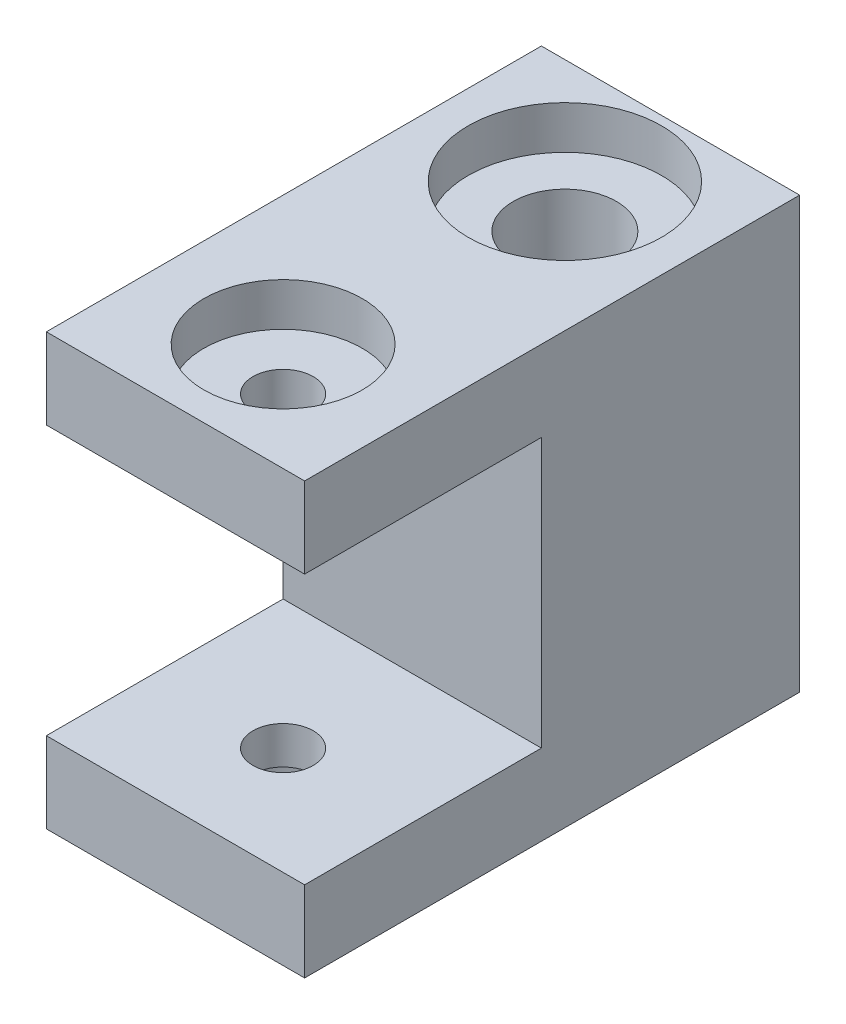
ISO-10303-21;
HEADER;
FILE_DESCRIPTION(('STEP AP214'),'2;1');
FILE_NAME('part.step','',(''),(''),'','','');
FILE_SCHEMA(('AUTOMOTIVE_DESIGN { 1 0 10303 214 1 1 1 1 }'));
ENDSEC;
DATA;
#1=APPLICATION_CONTEXT('core data for automotive mechanical design processes');
#2=APPLICATION_PROTOCOL_DEFINITION('international standard','automotive_design',2000,#1);
#3=PRODUCT_CONTEXT('',#1,'mechanical');
#4=PRODUCT('Part','Part','',(#3));
#5=PRODUCT_RELATED_PRODUCT_CATEGORY('part','',(#4));
#6=PRODUCT_DEFINITION_FORMATION('','',#4);
#7=PRODUCT_DEFINITION_CONTEXT('part definition',#1,'design');
#8=PRODUCT_DEFINITION('design','',#6,#7);
#9=PRODUCT_DEFINITION_SHAPE('','',#8);
#10=(LENGTH_UNIT() NAMED_UNIT(*) SI_UNIT(.MILLI.,.METRE.));
#11=(NAMED_UNIT(*) PLANE_ANGLE_UNIT() SI_UNIT($,.RADIAN.));
#12=(NAMED_UNIT(*) SI_UNIT($,.STERADIAN.) SOLID_ANGLE_UNIT());
#13=UNCERTAINTY_MEASURE_WITH_UNIT(LENGTH_MEASURE(1.E-05),#10,'distance_accuracy_value','');
#14=(GEOMETRIC_REPRESENTATION_CONTEXT(3) GLOBAL_UNCERTAINTY_ASSIGNED_CONTEXT((#13)) GLOBAL_UNIT_ASSIGNED_CONTEXT((#10,
#11,#12)) REPRESENTATION_CONTEXT('',''));
#15=CARTESIAN_POINT('',(0.,0.,0.));
#16=DIRECTION('',(0.,0.,1.));
#17=DIRECTION('',(1.,0.,0.));
#18=AXIS2_PLACEMENT_3D('',#15,#16,#17);
#19=CARTESIAN_POINT('',(0.,-31.75,20.6375));
#20=DIRECTION('',(0.,1.,0.));
#21=DIRECTION('',(0.,0.,1.));
#22=AXIS2_PLACEMENT_3D('',#19,#20,#21);
#23=CYLINDRICAL_SURFACE('',#22,4.445);
#24=CARTESIAN_POINT('',(0.,-19.84375,20.6375));
#25=DIRECTION('',(0.,-1.,0.));
#26=DIRECTION('',(0.,0.,-1.));
#27=AXIS2_PLACEMENT_3D('',#24,#25,#26);
#28=CIRCLE('',#27,4.445);
#29=CARTESIAN_POINT('',(0.,-19.84375,16.1925));
#30=VERTEX_POINT('',#29);
#31=EDGE_CURVE('E170',#30,#30,#28,.T.);
#32=ORIENTED_EDGE('',*,*,#31,.F.);
#33=EDGE_LOOP('',(#32));
#34=FACE_BOUND('',#33,.T.);
#35=CARTESIAN_POINT('',(0.,-25.4,20.6375));
#36=DIRECTION('',(0.,-1.,0.));
#37=DIRECTION('',(0.,0.,-1.));
#38=AXIS2_PLACEMENT_3D('',#35,#36,#37);
#39=CIRCLE('',#38,4.445);
#40=CARTESIAN_POINT('',(0.,-25.4,16.1925));
#41=VERTEX_POINT('',#40);
#42=EDGE_CURVE('E176',#41,#41,#39,.F.);
#43=ORIENTED_EDGE('',*,*,#42,.F.);
#44=EDGE_LOOP('',(#43));
#45=FACE_BOUND('',#44,.T.);
#46=ADVANCED_FACE('F34',(#34,#45),#23,.F.);
#47=CARTESIAN_POINT('',(0.,19.84375,20.6375));
#48=DIRECTION('',(0.,1.,0.));
#49=DIRECTION('',(0.,0.,1.));
#50=AXIS2_PLACEMENT_3D('',#47,#48,#49);
#51=CIRCLE('',#50,4.445);
#52=CARTESIAN_POINT('',(0.,19.84375,25.0825));
#53=VERTEX_POINT('',#52);
#54=EDGE_CURVE('E138',#53,#53,#51,.T.);
#55=ORIENTED_EDGE('',*,*,#54,.F.);
#56=EDGE_LOOP('',(#55));
#57=FACE_BOUND('',#56,.T.);
#58=CARTESIAN_POINT('',(0.,25.4,20.6375));
#59=DIRECTION('',(0.,1.,0.));
#60=DIRECTION('',(0.,0.,1.));
#61=AXIS2_PLACEMENT_3D('',#58,#59,#60);
#62=CIRCLE('',#61,4.445);
#63=CARTESIAN_POINT('',(0.,25.4,25.0825));
#64=VERTEX_POINT('',#63);
#65=EDGE_CURVE('E173',#64,#64,#62,.F.);
#66=ORIENTED_EDGE('',*,*,#65,.F.);
#67=EDGE_LOOP('',(#66));
#68=FACE_BOUND('',#67,.T.);
#69=ADVANCED_FACE('F237',(#57,#68),#23,.F.);
#70=CARTESIAN_POINT('',(0.,0.,36.5125));
#71=DIRECTION('',(0.,0.,-1.));
#72=DIRECTION('',(-1.,0.,0.));
#73=AXIS2_PLACEMENT_3D('',#70,#71,#72);
#74=PLANE('',#73);
#75=DIRECTION('',(0.,-1.,0.));
#76=VECTOR('',#75,1.);
#77=CARTESIAN_POINT('',(-19.05,-31.75,36.5125));
#78=LINE('',#77,#76);
#79=CARTESIAN_POINT('',(-19.05,31.75,36.5125));
#80=VERTEX_POINT('',#79);
#81=CARTESIAN_POINT('',(-19.05,19.84375,36.5125));
#82=VERTEX_POINT('',#81);
#83=EDGE_CURVE('E153',#80,#82,#78,.T.);
#84=ORIENTED_EDGE('',*,*,#83,.T.);
#85=DIRECTION('',(1.,0.,0.));
#86=VECTOR('',#85,1.);
#87=CARTESIAN_POINT('',(-19.05,19.84375,36.5125));
#88=LINE('',#87,#86);
#89=CARTESIAN_POINT('',(19.05,19.84375,36.5125));
#90=VERTEX_POINT('',#89);
#91=EDGE_CURVE('E144',#82,#90,#88,.T.);
#92=ORIENTED_EDGE('',*,*,#91,.T.);
#93=DIRECTION('',(0.,1.,0.));
#94=VECTOR('',#93,1.);
#95=CARTESIAN_POINT('',(19.05,-31.75,36.5125));
#96=LINE('',#95,#94);
#97=CARTESIAN_POINT('',(19.05,31.75,36.5125));
#98=VERTEX_POINT('',#97);
#99=EDGE_CURVE('E89',#90,#98,#96,.T.);
#100=ORIENTED_EDGE('',*,*,#99,.T.);
#101=DIRECTION('',(-1.,0.,0.));
#102=VECTOR('',#101,1.);
#103=CARTESIAN_POINT('',(-19.05,31.75,36.5125));
#104=LINE('',#103,#102);
#105=EDGE_CURVE('E151',#98,#80,#104,.T.);
#106=ORIENTED_EDGE('',*,*,#105,.T.);
#107=EDGE_LOOP('',(#84,#92,#100,#106));
#108=FACE_BOUND('',#107,.T.);
#109=ADVANCED_FACE('F230',(#108),#74,.F.);
#110=CARTESIAN_POINT('',(19.05,-31.75,36.5125));
#111=DIRECTION('',(-1.,0.,0.));
#112=DIRECTION('',(0.,0.,1.));
#113=AXIS2_PLACEMENT_3D('',#110,#111,#112);
#114=PLANE('',#113);
#115=ORIENTED_EDGE('',*,*,#99,.F.);
#116=DIRECTION('',(0.,0.,1.));
#117=VECTOR('',#116,1.);
#118=CARTESIAN_POINT('',(19.05,19.84375,1.5875));
#119=LINE('',#118,#117);
#120=CARTESIAN_POINT('',(19.05,19.84375,1.5875));
#121=VERTEX_POINT('',#120);
#122=EDGE_CURVE('E133',#121,#90,#119,.T.);
#123=ORIENTED_EDGE('',*,*,#122,.F.);
#124=DIRECTION('',(0.,1.,0.));
#125=VECTOR('',#124,1.);
#126=CARTESIAN_POINT('',(19.05,-19.84375,1.5875));
#127=LINE('',#126,#125);
#128=CARTESIAN_POINT('',(19.05,-19.84375,1.5875));
#129=VERTEX_POINT('',#128);
#130=EDGE_CURVE('E135',#129,#121,#127,.T.);
#131=ORIENTED_EDGE('',*,*,#130,.F.);
#132=DIRECTION('',(0.,0.,-1.));
#133=VECTOR('',#132,1.);
#134=CARTESIAN_POINT('',(19.05,-19.84375,1.5875));
#135=LINE('',#134,#133);
#136=CARTESIAN_POINT('',(19.05,-19.84375,36.5125));
#137=VERTEX_POINT('',#136);
#138=EDGE_CURVE('E114',#137,#129,#135,.T.);
#139=ORIENTED_EDGE('',*,*,#138,.F.);
#140=CARTESIAN_POINT('',(19.05,-31.75,36.5125));
#141=VERTEX_POINT('',#140);
#142=EDGE_CURVE('E149',#141,#137,#96,.T.);
#143=ORIENTED_EDGE('',*,*,#142,.F.);
#144=DIRECTION('',(0.,0.,-1.));
#145=VECTOR('',#144,1.);
#146=CARTESIAN_POINT('',(19.05,-31.75,36.5125));
#147=LINE('',#146,#145);
#148=CARTESIAN_POINT('',(19.05,-31.75,-36.5125));
#149=VERTEX_POINT('',#148);
#150=EDGE_CURVE('E157',#141,#149,#147,.T.);
#151=ORIENTED_EDGE('',*,*,#150,.T.);
#152=DIRECTION('',(0.,1.,0.));
#153=VECTOR('',#152,1.);
#154=CARTESIAN_POINT('',(19.05,-31.75,-36.5125));
#155=LINE('',#154,#153);
#156=CARTESIAN_POINT('',(19.05,31.75,-36.5125));
#157=VERTEX_POINT('',#156);
#158=EDGE_CURVE('E146',#149,#157,#155,.T.);
#159=ORIENTED_EDGE('',*,*,#158,.T.);
#160=DIRECTION('',(0.,0.,-1.));
#161=VECTOR('',#160,1.);
#162=CARTESIAN_POINT('',(19.05,31.75,36.5125));
#163=LINE('',#162,#161);
#164=EDGE_CURVE('E11',#98,#157,#163,.T.);
#165=ORIENTED_EDGE('',*,*,#164,.F.);
#166=EDGE_LOOP('',(#115,#123,#131,#139,#143,#151,#159,#165));
#167=FACE_BOUND('',#166,.T.);
#168=ADVANCED_FACE('F36',(#167),#114,.F.);
#169=CARTESIAN_POINT('',(-19.05,31.75,36.5125));
#170=DIRECTION('',(0.,-1.,0.));
#171=DIRECTION('',(0.,0.,-1.));
#172=AXIS2_PLACEMENT_3D('',#169,#170,#171);
#173=PLANE('',#172);
#174=CARTESIAN_POINT('',(0.,31.75,-20.9296));
#175=DIRECTION('',(0.,1.,0.));
#176=DIRECTION('',(0.,0.,1.));
#177=AXIS2_PLACEMENT_3D('',#174,#175,#176);
#178=CIRCLE('',#177,14.2621);
#179=CARTESIAN_POINT('',(0.,31.75,-6.6675));
#180=VERTEX_POINT('',#179);
#181=EDGE_CURVE('E178',#180,#180,#178,.T.);
#182=ORIENTED_EDGE('',*,*,#181,.F.);
#183=EDGE_LOOP('',(#182));
#184=FACE_BOUND('',#183,.T.);
#185=CARTESIAN_POINT('',(0.,31.75,20.6375));
#186=DIRECTION('',(0.,1.,0.));
#187=DIRECTION('',(0.,0.,1.));
#188=AXIS2_PLACEMENT_3D('',#185,#186,#187);
#189=CIRCLE('',#188,11.684);
#190=CARTESIAN_POINT('',(0.,31.75,32.3215));
#191=VERTEX_POINT('',#190);
#192=EDGE_CURVE('E198',#191,#191,#189,.T.);
#193=ORIENTED_EDGE('',*,*,#192,.F.);
#194=EDGE_LOOP('',(#193));
#195=FACE_BOUND('',#194,.T.);
#196=DIRECTION('',(-1.,0.,0.));
#197=VECTOR('',#196,1.);
#198=CARTESIAN_POINT('',(-19.05,31.75,-36.5125));
#199=LINE('',#198,#197);
#200=CARTESIAN_POINT('',(-19.05,31.75,-36.5125));
#201=VERTEX_POINT('',#200);
#202=EDGE_CURVE('E160',#157,#201,#199,.T.);
#203=ORIENTED_EDGE('',*,*,#202,.T.);
#204=DIRECTION('',(0.,0.,-1.));
#205=VECTOR('',#204,1.);
#206=CARTESIAN_POINT('',(-19.05,31.75,36.5125));
#207=LINE('',#206,#205);
#208=EDGE_CURVE('E43',#80,#201,#207,.T.);
#209=ORIENTED_EDGE('',*,*,#208,.F.);
#210=ORIENTED_EDGE('',*,*,#105,.F.);
#211=ORIENTED_EDGE('',*,*,#164,.T.);
#212=EDGE_LOOP('',(#203,#209,#210,#211));
#213=FACE_BOUND('',#212,.T.);
#214=ADVANCED_FACE('F206',(#184,#195,#213),#173,.F.);
#215=CARTESIAN_POINT('',(-19.05,-31.75,36.5125));
#216=DIRECTION('',(1.,0.,0.));
#217=DIRECTION('',(0.,0.,-1.));
#218=AXIS2_PLACEMENT_3D('',#215,#216,#217);
#219=PLANE('',#218);
#220=DIRECTION('',(0.,1.,0.));
#221=VECTOR('',#220,1.);
#222=CARTESIAN_POINT('',(-19.05,-19.84375,1.5875));
#223=LINE('',#222,#221);
#224=CARTESIAN_POINT('',(-19.05,-19.84375,1.5875));
#225=VERTEX_POINT('',#224);
#226=CARTESIAN_POINT('',(-19.05,19.84375,1.5875));
#227=VERTEX_POINT('',#226);
#228=EDGE_CURVE('E122',#225,#227,#223,.T.);
#229=ORIENTED_EDGE('',*,*,#228,.T.);
#230=DIRECTION('',(0.,0.,1.));
#231=VECTOR('',#230,1.);
#232=CARTESIAN_POINT('',(-19.05,19.84375,1.5875));
#233=LINE('',#232,#231);
#234=EDGE_CURVE('E127',#227,#82,#233,.T.);
#235=ORIENTED_EDGE('',*,*,#234,.T.);
#236=ORIENTED_EDGE('',*,*,#83,.F.);
#237=ORIENTED_EDGE('',*,*,#208,.T.);
#238=DIRECTION('',(0.,-1.,0.));
#239=VECTOR('',#238,1.);
#240=CARTESIAN_POINT('',(-19.05,-31.75,-36.5125));
#241=LINE('',#240,#239);
#242=CARTESIAN_POINT('',(-19.05,-31.75,-36.5125));
#243=VERTEX_POINT('',#242);
#244=EDGE_CURVE('E162',#201,#243,#241,.T.);
#245=ORIENTED_EDGE('',*,*,#244,.T.);
#246=DIRECTION('',(0.,0.,-1.));
#247=VECTOR('',#246,1.);
#248=CARTESIAN_POINT('',(-19.05,-31.75,36.5125));
#249=LINE('',#248,#247);
#250=CARTESIAN_POINT('',(-19.05,-31.75,36.5125));
#251=VERTEX_POINT('',#250);
#252=EDGE_CURVE('E166',#251,#243,#249,.T.);
#253=ORIENTED_EDGE('',*,*,#252,.F.);
#254=CARTESIAN_POINT('',(-19.05,-19.84375,36.5125));
#255=VERTEX_POINT('',#254);
#256=EDGE_CURVE('E132',#255,#251,#78,.T.);
#257=ORIENTED_EDGE('',*,*,#256,.F.);
#258=DIRECTION('',(0.,0.,-1.));
#259=VECTOR('',#258,1.);
#260=CARTESIAN_POINT('',(-19.05,-19.84375,1.5875));
#261=LINE('',#260,#259);
#262=EDGE_CURVE('E51',#255,#225,#261,.T.);
#263=ORIENTED_EDGE('',*,*,#262,.T.);
#264=EDGE_LOOP('',(#229,#235,#236,#237,#245,#253,#257,#263));
#265=FACE_BOUND('',#264,.T.);
#266=ADVANCED_FACE('F130',(#265),#219,.F.);
#267=CARTESIAN_POINT('',(-19.05,-31.75,36.5125));
#268=DIRECTION('',(0.,1.,0.));
#269=DIRECTION('',(0.,0.,1.));
#270=AXIS2_PLACEMENT_3D('',#267,#268,#269);
#271=PLANE('',#270);
#272=CARTESIAN_POINT('',(0.,-31.75,-20.9296));
#273=DIRECTION('',(0.,1.,0.));
#274=DIRECTION('',(0.,0.,1.));
#275=AXIS2_PLACEMENT_3D('',#272,#273,#274);
#276=CIRCLE('',#275,14.2621);
#277=CARTESIAN_POINT('',(0.,-31.75,-6.6675));
#278=VERTEX_POINT('',#277);
#279=EDGE_CURVE('E194',#278,#278,#276,.T.);
#280=ORIENTED_EDGE('',*,*,#279,.T.);
#281=EDGE_LOOP('',(#280));
#282=FACE_BOUND('',#281,.T.);
#283=CARTESIAN_POINT('',(0.,-31.75,20.6375));
#284=DIRECTION('',(0.,1.,0.));
#285=DIRECTION('',(0.,0.,1.));
#286=AXIS2_PLACEMENT_3D('',#283,#284,#285);
#287=CIRCLE('',#286,11.684);
#288=CARTESIAN_POINT('',(0.,-31.75,32.3215));
#289=VERTEX_POINT('',#288);
#290=EDGE_CURVE('E186',#289,#289,#287,.T.);
#291=ORIENTED_EDGE('',*,*,#290,.T.);
#292=EDGE_LOOP('',(#291));
#293=FACE_BOUND('',#292,.T.);
#294=DIRECTION('',(1.,0.,0.));
#295=VECTOR('',#294,1.);
#296=CARTESIAN_POINT('',(-19.05,-31.75,-36.5125));
#297=LINE('',#296,#295);
#298=EDGE_CURVE('E81',#243,#149,#297,.T.);
#299=ORIENTED_EDGE('',*,*,#298,.T.);
#300=ORIENTED_EDGE('',*,*,#150,.F.);
#301=DIRECTION('',(1.,0.,0.));
#302=VECTOR('',#301,1.);
#303=CARTESIAN_POINT('',(-19.05,-31.75,36.5125));
#304=LINE('',#303,#302);
#305=EDGE_CURVE('E60',#251,#141,#304,.T.);
#306=ORIENTED_EDGE('',*,*,#305,.F.);
#307=ORIENTED_EDGE('',*,*,#252,.T.);
#308=EDGE_LOOP('',(#299,#300,#306,#307));
#309=FACE_BOUND('',#308,.T.);
#310=ADVANCED_FACE('F219',(#282,#293,#309),#271,.F.);
#311=ORIENTED_EDGE('',*,*,#142,.T.);
#312=DIRECTION('',(1.,0.,0.));
#313=VECTOR('',#312,1.);
#314=CARTESIAN_POINT('',(-19.05,-19.84375,36.5125));
#315=LINE('',#314,#313);
#316=EDGE_CURVE('E119',#255,#137,#315,.T.);
#317=ORIENTED_EDGE('',*,*,#316,.F.);
#318=ORIENTED_EDGE('',*,*,#256,.T.);
#319=ORIENTED_EDGE('',*,*,#305,.T.);
#320=EDGE_LOOP('',(#311,#317,#318,#319));
#321=FACE_BOUND('',#320,.T.);
#322=ADVANCED_FACE('F221',(#321),#74,.F.);
#323=CARTESIAN_POINT('',(0.,0.,-36.5125));
#324=DIRECTION('',(0.,0.,-1.));
#325=DIRECTION('',(-1.,0.,0.));
#326=AXIS2_PLACEMENT_3D('',#323,#324,#325);
#327=PLANE('',#326);
#328=ORIENTED_EDGE('',*,*,#158,.F.);
#329=ORIENTED_EDGE('',*,*,#298,.F.);
#330=ORIENTED_EDGE('',*,*,#244,.F.);
#331=ORIENTED_EDGE('',*,*,#202,.F.);
#332=EDGE_LOOP('',(#328,#329,#330,#331));
#333=FACE_BOUND('',#332,.T.);
#334=ADVANCED_FACE('F216',(#333),#327,.T.);
#335=CARTESIAN_POINT('',(-19.05,19.84375,1.5875));
#336=DIRECTION('',(0.,1.,0.));
#337=DIRECTION('',(0.,0.,1.));
#338=AXIS2_PLACEMENT_3D('',#335,#336,#337);
#339=PLANE('',#338);
#340=ORIENTED_EDGE('',*,*,#54,.T.);
#341=EDGE_LOOP('',(#340));
#342=FACE_BOUND('',#341,.T.);
#343=ORIENTED_EDGE('',*,*,#122,.T.);
#344=ORIENTED_EDGE('',*,*,#91,.F.);
#345=ORIENTED_EDGE('',*,*,#234,.F.);
#346=DIRECTION('',(1.,0.,0.));
#347=VECTOR('',#346,1.);
#348=CARTESIAN_POINT('',(-19.05,19.84375,1.5875));
#349=LINE('',#348,#347);
#350=EDGE_CURVE('E118',#227,#121,#349,.T.);
#351=ORIENTED_EDGE('',*,*,#350,.T.);
#352=EDGE_LOOP('',(#343,#344,#345,#351));
#353=FACE_BOUND('',#352,.T.);
#354=ADVANCED_FACE('F249',(#342,#353),#339,.F.);
#355=CARTESIAN_POINT('',(-19.05,-19.84375,1.5875));
#356=DIRECTION('',(0.,0.,-1.));
#357=DIRECTION('',(-1.,0.,0.));
#358=AXIS2_PLACEMENT_3D('',#355,#356,#357);
#359=PLANE('',#358);
#360=ORIENTED_EDGE('',*,*,#130,.T.);
#361=ORIENTED_EDGE('',*,*,#350,.F.);
#362=ORIENTED_EDGE('',*,*,#228,.F.);
#363=DIRECTION('',(1.,0.,0.));
#364=VECTOR('',#363,1.);
#365=CARTESIAN_POINT('',(-19.05,-19.84375,1.5875));
#366=LINE('',#365,#364);
#367=EDGE_CURVE('E110',#225,#129,#366,.T.);
#368=ORIENTED_EDGE('',*,*,#367,.T.);
#369=EDGE_LOOP('',(#360,#361,#362,#368));
#370=FACE_BOUND('',#369,.T.);
#371=ADVANCED_FACE('F123',(#370),#359,.F.);
#372=CARTESIAN_POINT('',(-19.05,-19.84375,1.5875));
#373=DIRECTION('',(0.,-1.,0.));
#374=DIRECTION('',(0.,0.,-1.));
#375=AXIS2_PLACEMENT_3D('',#372,#373,#374);
#376=PLANE('',#375);
#377=ORIENTED_EDGE('',*,*,#31,.T.);
#378=EDGE_LOOP('',(#377));
#379=FACE_BOUND('',#378,.T.);
#380=ORIENTED_EDGE('',*,*,#138,.T.);
#381=ORIENTED_EDGE('',*,*,#367,.F.);
#382=ORIENTED_EDGE('',*,*,#262,.F.);
#383=ORIENTED_EDGE('',*,*,#316,.T.);
#384=EDGE_LOOP('',(#380,#381,#382,#383));
#385=FACE_BOUND('',#384,.T.);
#386=ADVANCED_FACE('F112',(#379,#385),#376,.F.);
#387=CARTESIAN_POINT('',(0.,25.4,20.6375));
#388=DIRECTION('',(0.,1.,0.));
#389=DIRECTION('',(0.,0.,1.));
#390=AXIS2_PLACEMENT_3D('',#387,#388,#389);
#391=PLANE('',#390);
#392=CARTESIAN_POINT('',(0.,25.4,20.6375));
#393=DIRECTION('',(0.,1.,0.));
#394=DIRECTION('',(0.,0.,1.));
#395=AXIS2_PLACEMENT_3D('',#392,#393,#394);
#396=CIRCLE('',#395,11.684);
#397=CARTESIAN_POINT('',(0.,25.4,32.3215));
#398=VERTEX_POINT('',#397);
#399=EDGE_CURVE('E175',#398,#398,#396,.T.);
#400=ORIENTED_EDGE('',*,*,#399,.T.);
#401=EDGE_LOOP('',(#400));
#402=FACE_BOUND('',#401,.T.);
#403=ORIENTED_EDGE('',*,*,#65,.T.);
#404=EDGE_LOOP('',(#403));
#405=FACE_BOUND('',#404,.T.);
#406=ADVANCED_FACE('F256',(#402,#405),#391,.T.);
#407=CARTESIAN_POINT('',(0.,25.4,20.6375));
#408=DIRECTION('',(0.,1.,0.));
#409=DIRECTION('',(0.,0.,1.));
#410=AXIS2_PLACEMENT_3D('',#407,#408,#409);
#411=CYLINDRICAL_SURFACE('',#410,11.684);
#412=ORIENTED_EDGE('',*,*,#399,.F.);
#413=EDGE_LOOP('',(#412));
#414=FACE_BOUND('',#413,.T.);
#415=ORIENTED_EDGE('',*,*,#192,.T.);
#416=EDGE_LOOP('',(#415));
#417=FACE_BOUND('',#416,.T.);
#418=ADVANCED_FACE('F204',(#414,#417),#411,.F.);
#419=CARTESIAN_POINT('',(0.,25.4,-20.9296));
#420=DIRECTION('',(0.,1.,0.));
#421=DIRECTION('',(0.,0.,1.));
#422=AXIS2_PLACEMENT_3D('',#419,#420,#421);
#423=CYLINDRICAL_SURFACE('',#422,14.2621);
#424=CARTESIAN_POINT('',(0.,25.4,-20.9296));
#425=DIRECTION('',(0.,1.,0.));
#426=DIRECTION('',(0.,0.,1.));
#427=AXIS2_PLACEMENT_3D('',#424,#425,#426);
#428=CIRCLE('',#427,14.2621);
#429=CARTESIAN_POINT('',(0.,25.4,-6.6675));
#430=VERTEX_POINT('',#429);
#431=EDGE_CURVE('E183',#430,#430,#428,.T.);
#432=ORIENTED_EDGE('',*,*,#431,.F.);
#433=EDGE_LOOP('',(#432));
#434=FACE_BOUND('',#433,.T.);
#435=ORIENTED_EDGE('',*,*,#181,.T.);
#436=EDGE_LOOP('',(#435));
#437=FACE_BOUND('',#436,.T.);
#438=ADVANCED_FACE('F300',(#434,#437),#423,.F.);
#439=CARTESIAN_POINT('',(0.,25.4,-20.9296));
#440=DIRECTION('',(0.,1.,0.));
#441=DIRECTION('',(0.,0.,1.));
#442=AXIS2_PLACEMENT_3D('',#439,#440,#441);
#443=PLANE('',#442);
#444=CARTESIAN_POINT('',(0.,25.4,-20.9296));
#445=DIRECTION('',(0.,1.,0.));
#446=DIRECTION('',(0.,0.,1.));
#447=AXIS2_PLACEMENT_3D('',#444,#445,#446);
#448=CIRCLE('',#447,7.62);
#449=CARTESIAN_POINT('',(0.,25.4,-13.3096));
#450=VERTEX_POINT('',#449);
#451=EDGE_CURVE('E384',#450,#450,#448,.T.);
#452=ORIENTED_EDGE('',*,*,#451,.F.);
#453=EDGE_LOOP('',(#452));
#454=FACE_BOUND('',#453,.T.);
#455=ORIENTED_EDGE('',*,*,#431,.T.);
#456=EDGE_LOOP('',(#455));
#457=FACE_BOUND('',#456,.T.);
#458=ADVANCED_FACE('F314',(#454,#457),#443,.T.);
#459=CARTESIAN_POINT('',(0.,-25.4,20.6375));
#460=DIRECTION('',(0.,-1.,0.));
#461=DIRECTION('',(0.,0.,1.));
#462=AXIS2_PLACEMENT_3D('',#459,#460,#461);
#463=PLANE('',#462);
#464=CARTESIAN_POINT('',(0.,-25.4,20.6375));
#465=DIRECTION('',(0.,1.,0.));
#466=DIRECTION('',(0.,0.,1.));
#467=AXIS2_PLACEMENT_3D('',#464,#465,#466);
#468=CIRCLE('',#467,11.684);
#469=CARTESIAN_POINT('',(0.,-25.4,32.3215));
#470=VERTEX_POINT('',#469);
#471=EDGE_CURVE('E179',#470,#470,#468,.T.);
#472=ORIENTED_EDGE('',*,*,#471,.F.);
#473=EDGE_LOOP('',(#472));
#474=FACE_BOUND('',#473,.T.);
#475=ORIENTED_EDGE('',*,*,#42,.T.);
#476=EDGE_LOOP('',(#475));
#477=FACE_BOUND('',#476,.T.);
#478=ADVANCED_FACE('F330',(#474,#477),#463,.T.);
#479=CARTESIAN_POINT('',(0.,-25.4,20.6375));
#480=DIRECTION('',(0.,-1.,0.));
#481=DIRECTION('',(0.,0.,-1.));
#482=AXIS2_PLACEMENT_3D('',#479,#480,#481);
#483=CYLINDRICAL_SURFACE('',#482,11.684);
#484=ORIENTED_EDGE('',*,*,#471,.T.);
#485=EDGE_LOOP('',(#484));
#486=FACE_BOUND('',#485,.T.);
#487=ORIENTED_EDGE('',*,*,#290,.F.);
#488=EDGE_LOOP('',(#487));
#489=FACE_BOUND('',#488,.T.);
#490=ADVANCED_FACE('F335',(#486,#489),#483,.F.);
#491=CARTESIAN_POINT('',(0.,-25.4,-20.9296));
#492=DIRECTION('',(0.,-1.,0.));
#493=DIRECTION('',(0.,0.,-1.));
#494=AXIS2_PLACEMENT_3D('',#491,#492,#493);
#495=CYLINDRICAL_SURFACE('',#494,14.2621);
#496=CARTESIAN_POINT('',(0.,-25.4,-20.9296));
#497=DIRECTION('',(0.,1.,0.));
#498=DIRECTION('',(0.,0.,1.));
#499=AXIS2_PLACEMENT_3D('',#496,#497,#498);
#500=CIRCLE('',#499,14.2621);
#501=CARTESIAN_POINT('',(0.,-25.4,-6.6675));
#502=VERTEX_POINT('',#501);
#503=EDGE_CURVE('E191',#502,#502,#500,.T.);
#504=ORIENTED_EDGE('',*,*,#503,.T.);
#505=EDGE_LOOP('',(#504));
#506=FACE_BOUND('',#505,.T.);
#507=ORIENTED_EDGE('',*,*,#279,.F.);
#508=EDGE_LOOP('',(#507));
#509=FACE_BOUND('',#508,.T.);
#510=ADVANCED_FACE('F344',(#506,#509),#495,.F.);
#511=CARTESIAN_POINT('',(0.,-25.4,-20.9296));
#512=DIRECTION('',(0.,-1.,0.));
#513=DIRECTION('',(0.,0.,1.));
#514=AXIS2_PLACEMENT_3D('',#511,#512,#513);
#515=PLANE('',#514);
#516=CARTESIAN_POINT('',(0.,-25.4,-20.9296));
#517=DIRECTION('',(0.,-1.,0.));
#518=DIRECTION('',(0.,0.,-1.));
#519=AXIS2_PLACEMENT_3D('',#516,#517,#518);
#520=CIRCLE('',#519,7.62);
#521=CARTESIAN_POINT('',(0.,-25.4,-28.5496));
#522=VERTEX_POINT('',#521);
#523=EDGE_CURVE('E38',#522,#522,#520,.T.);
#524=ORIENTED_EDGE('',*,*,#523,.F.);
#525=EDGE_LOOP('',(#524));
#526=FACE_BOUND('',#525,.T.);
#527=ORIENTED_EDGE('',*,*,#503,.F.);
#528=EDGE_LOOP('',(#527));
#529=FACE_BOUND('',#528,.T.);
#530=ADVANCED_FACE('F352',(#526,#529),#515,.T.);
#531=CARTESIAN_POINT('',(0.,-31.75,-20.9296));
#532=DIRECTION('',(0.,1.,0.));
#533=DIRECTION('',(0.,0.,1.));
#534=AXIS2_PLACEMENT_3D('',#531,#532,#533);
#535=CYLINDRICAL_SURFACE('',#534,7.62);
#536=ORIENTED_EDGE('',*,*,#523,.T.);
#537=EDGE_LOOP('',(#536));
#538=FACE_BOUND('',#537,.T.);
#539=ORIENTED_EDGE('',*,*,#451,.T.);
#540=EDGE_LOOP('',(#539));
#541=FACE_BOUND('',#540,.T.);
#542=ADVANCED_FACE('F361',(#538,#541),#535,.F.);
#543=CLOSED_SHELL('',(#46,#69,#109,#168,#214,#266,#310,#322,#334,#354,#371,#386,#406,#418,#438,
#458,#478,#490,#510,#530,#542));
#544=MANIFOLD_SOLID_BREP('B2',#543);
#545=ADVANCED_BREP_SHAPE_REPRESENTATION('',(#18,#544),#14);
#546=SHAPE_DEFINITION_REPRESENTATION(#9,#545);
ENDSEC;
END-ISO-10303-21;
